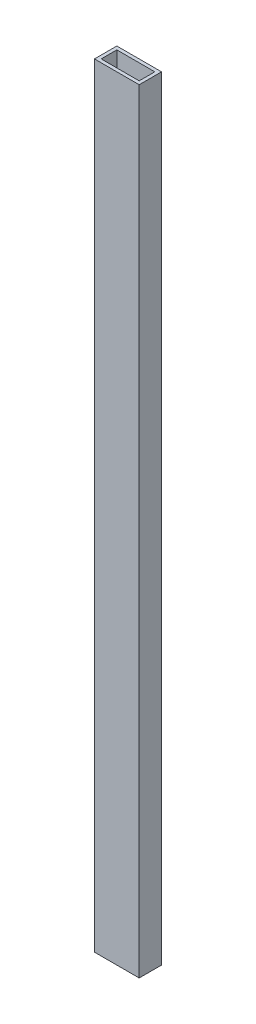
ISO-10303-21;
HEADER;
FILE_DESCRIPTION(('STEP AP214'),'2;1');
FILE_NAME('part.step','',(''),(''),'','','');
FILE_SCHEMA(('AUTOMOTIVE_DESIGN { 1 0 10303 214 1 1 1 1 }'));
ENDSEC;
DATA;
#1=APPLICATION_CONTEXT('core data for automotive mechanical design processes');
#2=APPLICATION_PROTOCOL_DEFINITION('international standard','automotive_design',2000,#1);
#3=PRODUCT_CONTEXT('',#1,'mechanical');
#4=PRODUCT('Part','Part','',(#3));
#5=PRODUCT_RELATED_PRODUCT_CATEGORY('part','',(#4));
#6=PRODUCT_DEFINITION_FORMATION('','',#4);
#7=PRODUCT_DEFINITION_CONTEXT('part definition',#1,'design');
#8=PRODUCT_DEFINITION('design','',#6,#7);
#9=PRODUCT_DEFINITION_SHAPE('','',#8);
#10=(LENGTH_UNIT() NAMED_UNIT(*) SI_UNIT(.MILLI.,.METRE.));
#11=(NAMED_UNIT(*) PLANE_ANGLE_UNIT() SI_UNIT($,.RADIAN.));
#12=(NAMED_UNIT(*) SI_UNIT($,.STERADIAN.) SOLID_ANGLE_UNIT());
#13=UNCERTAINTY_MEASURE_WITH_UNIT(LENGTH_MEASURE(1.E-05),#10,'distance_accuracy_value','');
#14=(GEOMETRIC_REPRESENTATION_CONTEXT(3) GLOBAL_UNCERTAINTY_ASSIGNED_CONTEXT((#13)) GLOBAL_UNIT_ASSIGNED_CONTEXT((#10,
#11,#12)) REPRESENTATION_CONTEXT('',''));
#15=CARTESIAN_POINT('',(0.,0.,0.));
#16=DIRECTION('',(0.,0.,1.));
#17=DIRECTION('',(1.,0.,0.));
#18=AXIS2_PLACEMENT_3D('',#15,#16,#17);
#19=CARTESIAN_POINT('',(-10.,368.360679774998,5.));
#20=DIRECTION('',(1.,0.,0.));
#21=DIRECTION('',(0.,0.,-1.));
#22=AXIS2_PLACEMENT_3D('',#19,#20,#21);
#23=PLANE('',#22);
#24=DIRECTION('',(0.,0.,1.));
#25=VECTOR('',#24,1.);
#26=CARTESIAN_POINT('',(-10.,346.,5.));
#27=LINE('',#26,#25);
#28=CARTESIAN_POINT('',(-9.99999999999999,346.,-5.));
#29=VERTEX_POINT('',#28);
#30=CARTESIAN_POINT('',(-10.,346.,5.));
#31=VERTEX_POINT('',#30);
#32=EDGE_CURVE('E153',#29,#31,#27,.T.);
#33=ORIENTED_EDGE('',*,*,#32,.F.);
#34=DIRECTION('',(0.,-1.,0.));
#35=VECTOR('',#34,1.);
#36=CARTESIAN_POINT('',(-10.,368.360679774998,-5.));
#37=LINE('',#36,#35);
#38=CARTESIAN_POINT('',(-10.,0.,-5.));
#39=VERTEX_POINT('',#38);
#40=EDGE_CURVE('E37',#29,#39,#37,.T.);
#41=ORIENTED_EDGE('',*,*,#40,.T.);
#42=DIRECTION('',(0.,0.,1.));
#43=VECTOR('',#42,1.);
#44=CARTESIAN_POINT('',(-10.,0.,5.));
#45=LINE('',#44,#43);
#46=CARTESIAN_POINT('',(-10.,0.,5.));
#47=VERTEX_POINT('',#46);
#48=EDGE_CURVE('E148',#39,#47,#45,.T.);
#49=ORIENTED_EDGE('',*,*,#48,.T.);
#50=DIRECTION('',(0.,-1.,0.));
#51=VECTOR('',#50,1.);
#52=CARTESIAN_POINT('',(-10.,368.360679774998,5.));
#53=LINE('',#52,#51);
#54=EDGE_CURVE('E147',#31,#47,#53,.T.);
#55=ORIENTED_EDGE('',*,*,#54,.F.);
#56=EDGE_LOOP('',(#33,#41,#49,#55));
#57=FACE_BOUND('',#56,.T.);
#58=ADVANCED_FACE('F33',(#57),#23,.F.);
#59=CARTESIAN_POINT('',(10.,368.360679774998,5.));
#60=DIRECTION('',(0.,0.,-1.));
#61=DIRECTION('',(-1.,0.,0.));
#62=AXIS2_PLACEMENT_3D('',#59,#60,#61);
#63=PLANE('',#62);
#64=DIRECTION('',(1.,0.,0.));
#65=VECTOR('',#64,1.);
#66=CARTESIAN_POINT('',(10.,346.,5.));
#67=LINE('',#66,#65);
#68=CARTESIAN_POINT('',(10.,346.,5.));
#69=VERTEX_POINT('',#68);
#70=EDGE_CURVE('E42',#31,#69,#67,.T.);
#71=ORIENTED_EDGE('',*,*,#70,.F.);
#72=ORIENTED_EDGE('',*,*,#54,.T.);
#73=DIRECTION('',(1.,0.,0.));
#74=VECTOR('',#73,1.);
#75=CARTESIAN_POINT('',(10.,0.,5.));
#76=LINE('',#75,#74);
#77=CARTESIAN_POINT('',(10.,0.,5.));
#78=VERTEX_POINT('',#77);
#79=EDGE_CURVE('E144',#47,#78,#76,.T.);
#80=ORIENTED_EDGE('',*,*,#79,.T.);
#81=DIRECTION('',(0.,-1.,0.));
#82=VECTOR('',#81,1.);
#83=CARTESIAN_POINT('',(10.,368.360679774998,5.));
#84=LINE('',#83,#82);
#85=EDGE_CURVE('E143',#69,#78,#84,.T.);
#86=ORIENTED_EDGE('',*,*,#85,.F.);
#87=EDGE_LOOP('',(#71,#72,#80,#86));
#88=FACE_BOUND('',#87,.T.);
#89=ADVANCED_FACE('F175',(#88),#63,.F.);
#90=CARTESIAN_POINT('',(10.,368.360679774998,5.));
#91=DIRECTION('',(-1.,0.,0.));
#92=DIRECTION('',(0.,0.,1.));
#93=AXIS2_PLACEMENT_3D('',#90,#91,#92);
#94=PLANE('',#93);
#95=DIRECTION('',(0.,0.,-1.));
#96=VECTOR('',#95,1.);
#97=CARTESIAN_POINT('',(10.,346.,5.));
#98=LINE('',#97,#96);
#99=CARTESIAN_POINT('',(10.,346.,-5.));
#100=VERTEX_POINT('',#99);
#101=EDGE_CURVE('E11',#69,#100,#98,.T.);
#102=ORIENTED_EDGE('',*,*,#101,.F.);
#103=ORIENTED_EDGE('',*,*,#85,.T.);
#104=DIRECTION('',(0.,0.,-1.));
#105=VECTOR('',#104,1.);
#106=CARTESIAN_POINT('',(10.,0.,5.));
#107=LINE('',#106,#105);
#108=CARTESIAN_POINT('',(10.,0.,-5.));
#109=VERTEX_POINT('',#108);
#110=EDGE_CURVE('E140',#78,#109,#107,.T.);
#111=ORIENTED_EDGE('',*,*,#110,.T.);
#112=DIRECTION('',(0.,-1.,0.));
#113=VECTOR('',#112,1.);
#114=CARTESIAN_POINT('',(10.,368.360679774998,-5.));
#115=LINE('',#114,#113);
#116=EDGE_CURVE('E139',#100,#109,#115,.T.);
#117=ORIENTED_EDGE('',*,*,#116,.F.);
#118=EDGE_LOOP('',(#102,#103,#111,#117));
#119=FACE_BOUND('',#118,.T.);
#120=ADVANCED_FACE('F166',(#119),#94,.F.);
#121=CARTESIAN_POINT('',(10.,368.360679774998,-5.));
#122=DIRECTION('',(0.,0.,1.));
#123=DIRECTION('',(1.,0.,0.));
#124=AXIS2_PLACEMENT_3D('',#121,#122,#123);
#125=PLANE('',#124);
#126=DIRECTION('',(-1.,0.,0.));
#127=VECTOR('',#126,1.);
#128=CARTESIAN_POINT('',(10.,346.,-5.));
#129=LINE('',#128,#127);
#130=EDGE_CURVE('E138',#100,#29,#129,.T.);
#131=ORIENTED_EDGE('',*,*,#130,.F.);
#132=ORIENTED_EDGE('',*,*,#116,.T.);
#133=DIRECTION('',(-1.,0.,0.));
#134=VECTOR('',#133,1.);
#135=CARTESIAN_POINT('',(10.,0.,-5.));
#136=LINE('',#135,#134);
#137=EDGE_CURVE('E135',#109,#39,#136,.T.);
#138=ORIENTED_EDGE('',*,*,#137,.T.);
#139=ORIENTED_EDGE('',*,*,#40,.F.);
#140=EDGE_LOOP('',(#131,#132,#138,#139));
#141=FACE_BOUND('',#140,.T.);
#142=ADVANCED_FACE('F161',(#141),#125,.F.);
#143=CARTESIAN_POINT('',(0.,0.,0.));
#144=DIRECTION('',(0.,1.,0.));
#145=DIRECTION('',(0.,0.,1.));
#146=AXIS2_PLACEMENT_3D('',#143,#144,#145);
#147=PLANE('',#146);
#148=DIRECTION('',(1.,0.,0.));
#149=VECTOR('',#148,1.);
#150=CARTESIAN_POINT('',(8.5,0.,-3.5));
#151=LINE('',#150,#149);
#152=CARTESIAN_POINT('',(-8.5,0.,-3.5));
#153=VERTEX_POINT('',#152);
#154=CARTESIAN_POINT('',(8.5,0.,-3.5));
#155=VERTEX_POINT('',#154);
#156=EDGE_CURVE('E126',#153,#155,#151,.T.);
#157=ORIENTED_EDGE('',*,*,#156,.F.);
#158=DIRECTION('',(0.,0.,-1.));
#159=VECTOR('',#158,1.);
#160=CARTESIAN_POINT('',(-8.5,0.,3.5));
#161=LINE('',#160,#159);
#162=CARTESIAN_POINT('',(-8.5,0.,3.5));
#163=VERTEX_POINT('',#162);
#164=EDGE_CURVE('E50',#163,#153,#161,.T.);
#165=ORIENTED_EDGE('',*,*,#164,.F.);
#166=DIRECTION('',(-1.,0.,0.));
#167=VECTOR('',#166,1.);
#168=CARTESIAN_POINT('',(8.5,0.,3.5));
#169=LINE('',#168,#167);
#170=CARTESIAN_POINT('',(8.5,0.,3.5));
#171=VERTEX_POINT('',#170);
#172=EDGE_CURVE('E117',#171,#163,#169,.T.);
#173=ORIENTED_EDGE('',*,*,#172,.F.);
#174=DIRECTION('',(0.,0.,1.));
#175=VECTOR('',#174,1.);
#176=CARTESIAN_POINT('',(8.5,0.,3.5));
#177=LINE('',#176,#175);
#178=EDGE_CURVE('E120',#155,#171,#177,.T.);
#179=ORIENTED_EDGE('',*,*,#178,.F.);
#180=EDGE_LOOP('',(#157,#165,#173,#179));
#181=FACE_BOUND('',#180,.T.);
#182=ORIENTED_EDGE('',*,*,#48,.F.);
#183=ORIENTED_EDGE('',*,*,#137,.F.);
#184=ORIENTED_EDGE('',*,*,#110,.F.);
#185=ORIENTED_EDGE('',*,*,#79,.F.);
#186=EDGE_LOOP('',(#182,#183,#184,#185));
#187=FACE_BOUND('',#186,.T.);
#188=ADVANCED_FACE('F170',(#181,#187),#147,.F.);
#189=CARTESIAN_POINT('',(340.,346.,-2.9999999999999));
#190=DIRECTION('',(0.,1.,0.));
#191=DIRECTION('',(0.,0.,1.));
#192=AXIS2_PLACEMENT_3D('',#189,#190,#191);
#193=PLANE('',#192);
#194=DIRECTION('',(0.,0.,-1.));
#195=VECTOR('',#194,1.);
#196=CARTESIAN_POINT('',(-8.5,346.,3.5));
#197=LINE('',#196,#195);
#198=CARTESIAN_POINT('',(-8.5,346.,3.5));
#199=VERTEX_POINT('',#198);
#200=CARTESIAN_POINT('',(-8.5,346.,-3.5));
#201=VERTEX_POINT('',#200);
#202=EDGE_CURVE('E102',#199,#201,#197,.T.);
#203=ORIENTED_EDGE('',*,*,#202,.T.);
#204=DIRECTION('',(1.,0.,0.));
#205=VECTOR('',#204,1.);
#206=CARTESIAN_POINT('',(8.5,346.,-3.5));
#207=LINE('',#206,#205);
#208=CARTESIAN_POINT('',(8.50000000000001,346.,-3.5));
#209=VERTEX_POINT('',#208);
#210=EDGE_CURVE('E111',#201,#209,#207,.T.);
#211=ORIENTED_EDGE('',*,*,#210,.T.);
#212=DIRECTION('',(0.,0.,1.));
#213=VECTOR('',#212,1.);
#214=CARTESIAN_POINT('',(8.5,346.,3.5));
#215=LINE('',#214,#213);
#216=CARTESIAN_POINT('',(8.5,346.,3.5));
#217=VERTEX_POINT('',#216);
#218=EDGE_CURVE('E58',#209,#217,#215,.T.);
#219=ORIENTED_EDGE('',*,*,#218,.T.);
#220=DIRECTION('',(-1.,0.,0.));
#221=VECTOR('',#220,1.);
#222=CARTESIAN_POINT('',(8.5,346.,3.5));
#223=LINE('',#222,#221);
#224=EDGE_CURVE('E108',#217,#199,#223,.T.);
#225=ORIENTED_EDGE('',*,*,#224,.T.);
#226=EDGE_LOOP('',(#203,#211,#219,#225));
#227=FACE_BOUND('',#226,.T.);
#228=ORIENTED_EDGE('',*,*,#130,.T.);
#229=ORIENTED_EDGE('',*,*,#32,.T.);
#230=ORIENTED_EDGE('',*,*,#70,.T.);
#231=ORIENTED_EDGE('',*,*,#101,.T.);
#232=EDGE_LOOP('',(#228,#229,#230,#231));
#233=FACE_BOUND('',#232,.T.);
#234=ADVANCED_FACE('F35',(#227,#233),#193,.T.);
#235=CARTESIAN_POINT('',(-8.5,346.,3.5));
#236=DIRECTION('',(-1.,0.,0.));
#237=DIRECTION('',(0.,0.,1.));
#238=AXIS2_PLACEMENT_3D('',#235,#236,#237);
#239=PLANE('',#238);
#240=ORIENTED_EDGE('',*,*,#164,.T.);
#241=DIRECTION('',(0.,-1.,0.));
#242=VECTOR('',#241,1.);
#243=CARTESIAN_POINT('',(-8.5,346.,-3.5));
#244=LINE('',#243,#242);
#245=EDGE_CURVE('E98',#201,#153,#244,.T.);
#246=ORIENTED_EDGE('',*,*,#245,.F.);
#247=ORIENTED_EDGE('',*,*,#202,.F.);
#248=DIRECTION('',(0.,-1.,0.));
#249=VECTOR('',#248,1.);
#250=CARTESIAN_POINT('',(-8.5,346.,3.5));
#251=LINE('',#250,#249);
#252=EDGE_CURVE('E130',#199,#163,#251,.T.);
#253=ORIENTED_EDGE('',*,*,#252,.T.);
#254=EDGE_LOOP('',(#240,#246,#247,#253));
#255=FACE_BOUND('',#254,.T.);
#256=ADVANCED_FACE('F100',(#255),#239,.F.);
#257=CARTESIAN_POINT('',(8.5,346.,3.5));
#258=DIRECTION('',(0.,0.,1.));
#259=DIRECTION('',(1.,0.,0.));
#260=AXIS2_PLACEMENT_3D('',#257,#258,#259);
#261=PLANE('',#260);
#262=ORIENTED_EDGE('',*,*,#172,.T.);
#263=ORIENTED_EDGE('',*,*,#252,.F.);
#264=ORIENTED_EDGE('',*,*,#224,.F.);
#265=DIRECTION('',(0.,-1.,0.));
#266=VECTOR('',#265,1.);
#267=CARTESIAN_POINT('',(8.5,346.,3.5));
#268=LINE('',#267,#266);
#269=EDGE_CURVE('E132',#217,#171,#268,.T.);
#270=ORIENTED_EDGE('',*,*,#269,.T.);
#271=EDGE_LOOP('',(#262,#263,#264,#270));
#272=FACE_BOUND('',#271,.T.);
#273=ADVANCED_FACE('F191',(#272),#261,.F.);
#274=CARTESIAN_POINT('',(8.5,346.,3.5));
#275=DIRECTION('',(1.,0.,0.));
#276=DIRECTION('',(0.,0.,-1.));
#277=AXIS2_PLACEMENT_3D('',#274,#275,#276);
#278=PLANE('',#277);
#279=ORIENTED_EDGE('',*,*,#178,.T.);
#280=ORIENTED_EDGE('',*,*,#269,.F.);
#281=ORIENTED_EDGE('',*,*,#218,.F.);
#282=DIRECTION('',(0.,-1.,0.));
#283=VECTOR('',#282,1.);
#284=CARTESIAN_POINT('',(8.5,346.,-3.5));
#285=LINE('',#284,#283);
#286=EDGE_CURVE('E107',#209,#155,#285,.T.);
#287=ORIENTED_EDGE('',*,*,#286,.T.);
#288=EDGE_LOOP('',(#279,#280,#281,#287));
#289=FACE_BOUND('',#288,.T.);
#290=ADVANCED_FACE('F194',(#289),#278,.F.);
#291=CARTESIAN_POINT('',(8.5,346.,-3.5));
#292=DIRECTION('',(0.,0.,-1.));
#293=DIRECTION('',(-1.,0.,0.));
#294=AXIS2_PLACEMENT_3D('',#291,#292,#293);
#295=PLANE('',#294);
#296=ORIENTED_EDGE('',*,*,#156,.T.);
#297=ORIENTED_EDGE('',*,*,#286,.F.);
#298=ORIENTED_EDGE('',*,*,#210,.F.);
#299=ORIENTED_EDGE('',*,*,#245,.T.);
#300=EDGE_LOOP('',(#296,#297,#298,#299));
#301=FACE_BOUND('',#300,.T.);
#302=ADVANCED_FACE('F112',(#301),#295,.F.);
#303=CLOSED_SHELL('',(#58,#89,#120,#142,#188,#234,#256,#273,#290,#302));
#304=MANIFOLD_SOLID_BREP('B2',#303);
#305=ADVANCED_BREP_SHAPE_REPRESENTATION('',(#18,#304),#14);
#306=SHAPE_DEFINITION_REPRESENTATION(#9,#305);
ENDSEC;
END-ISO-10303-21;
